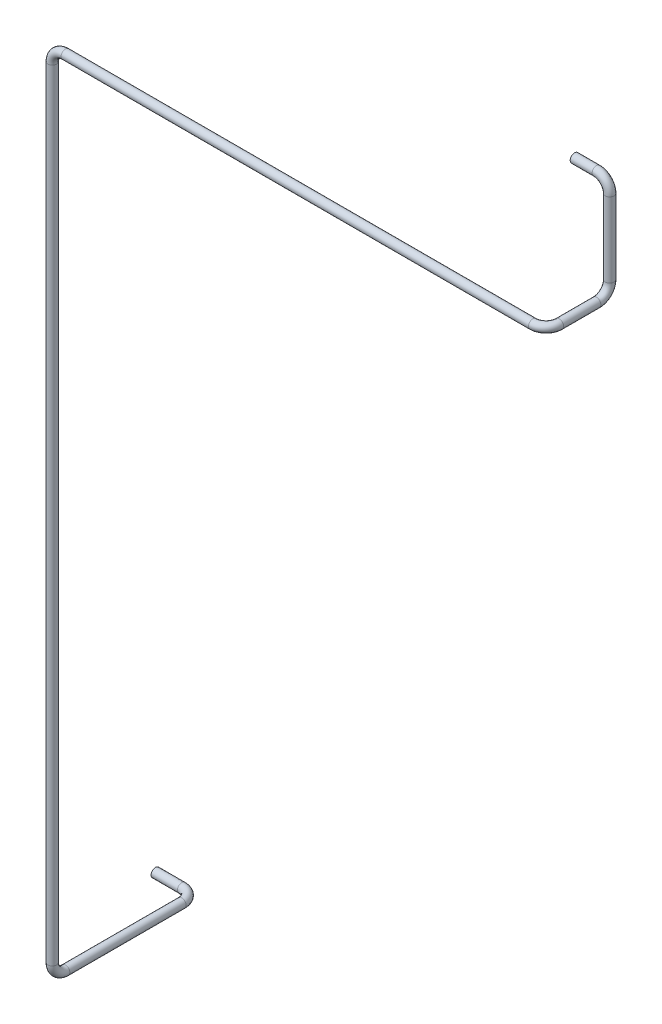
ISO-10303-21;
HEADER;
FILE_DESCRIPTION(('STEP AP214'),'2;1');
FILE_NAME('part.step','',(''),(''),'','','');
FILE_SCHEMA(('AUTOMOTIVE_DESIGN { 1 0 10303 214 1 1 1 1 }'));
ENDSEC;
DATA;
#1=APPLICATION_CONTEXT('core data for automotive mechanical design processes');
#2=APPLICATION_PROTOCOL_DEFINITION('international standard','automotive_design',2000,#1);
#3=PRODUCT_CONTEXT('',#1,'mechanical');
#4=PRODUCT('Part','Part','',(#3));
#5=PRODUCT_RELATED_PRODUCT_CATEGORY('part','',(#4));
#6=PRODUCT_DEFINITION_FORMATION('','',#4);
#7=PRODUCT_DEFINITION_CONTEXT('part definition',#1,'design');
#8=PRODUCT_DEFINITION('design','',#6,#7);
#9=PRODUCT_DEFINITION_SHAPE('','',#8);
#10=(LENGTH_UNIT() NAMED_UNIT(*) SI_UNIT(.MILLI.,.METRE.));
#11=(NAMED_UNIT(*) PLANE_ANGLE_UNIT() SI_UNIT($,.RADIAN.));
#12=(NAMED_UNIT(*) SI_UNIT($,.STERADIAN.) SOLID_ANGLE_UNIT());
#13=UNCERTAINTY_MEASURE_WITH_UNIT(LENGTH_MEASURE(1.E-05),#10,'distance_accuracy_value','');
#14=(GEOMETRIC_REPRESENTATION_CONTEXT(3) GLOBAL_UNCERTAINTY_ASSIGNED_CONTEXT((#13)) GLOBAL_UNIT_ASSIGNED_CONTEXT((#10,
#11,#12)) REPRESENTATION_CONTEXT('',''));
#15=CARTESIAN_POINT('',(0.,0.,0.));
#16=DIRECTION('',(0.,0.,1.));
#17=DIRECTION('',(1.,0.,0.));
#18=AXIS2_PLACEMENT_3D('',#15,#16,#17);
#19=CARTESIAN_POINT('',(109.,471.,236.));
#20=DIRECTION('',(-1.,0.,0.));
#21=DIRECTION('',(0.,0.,-1.));
#22=AXIS2_PLACEMENT_3D('',#19,#20,#21);
#23=PLANE('',#22);
#24=CARTESIAN_POINT('',(109.,471.,236.));
#25=DIRECTION('',(-1.,0.,0.));
#26=DIRECTION('',(0.,0.,-1.));
#27=AXIS2_PLACEMENT_3D('',#24,#25,#26);
#28=CIRCLE('',#27,0.5);
#29=CARTESIAN_POINT('',(109.,471.,235.5));
#30=VERTEX_POINT('',#29);
#31=EDGE_CURVE('E412',#30,#30,#28,.T.);
#32=ORIENTED_EDGE('',*,*,#31,.F.);
#33=EDGE_LOOP('',(#32));
#34=FACE_BOUND('',#33,.T.);
#35=CARTESIAN_POINT('',(109.,471.,236.));
#36=DIRECTION('',(-1.,0.,0.));
#37=DIRECTION('',(0.,0.,1.));
#38=AXIS2_PLACEMENT_3D('',#35,#36,#37);
#39=CIRCLE('',#38,2.);
#40=CARTESIAN_POINT('',(109.,471.,238.));
#41=VERTEX_POINT('',#40);
#42=EDGE_CURVE('E75',#41,#41,#39,.T.);
#43=ORIENTED_EDGE('',*,*,#42,.T.);
#44=EDGE_LOOP('',(#43));
#45=FACE_BOUND('',#44,.T.);
#46=ADVANCED_FACE('F52',(#34,#45),#23,.T.);
#47=CARTESIAN_POINT('',(-118.,57.5,200.));
#48=DIRECTION('',(1.,0.,0.));
#49=DIRECTION('',(0.,0.,-1.));
#50=AXIS2_PLACEMENT_3D('',#47,#48,#49);
#51=PLANE('',#50);
#52=CARTESIAN_POINT('',(-118.,57.5,200.));
#53=DIRECTION('',(1.,0.,0.));
#54=DIRECTION('',(0.,0.,-1.));
#55=AXIS2_PLACEMENT_3D('',#52,#53,#54);
#56=CIRCLE('',#55,0.5);
#57=CARTESIAN_POINT('',(-118.,57.5,199.5));
#58=VERTEX_POINT('',#57);
#59=EDGE_CURVE('E73',#58,#58,#56,.T.);
#60=ORIENTED_EDGE('',*,*,#59,.T.);
#61=EDGE_LOOP('',(#60));
#62=FACE_BOUND('',#61,.T.);
#63=CARTESIAN_POINT('',(-118.,57.5,200.));
#64=DIRECTION('',(1.,0.,0.));
#65=DIRECTION('',(0.,0.,-1.));
#66=AXIS2_PLACEMENT_3D('',#63,#64,#65);
#67=CIRCLE('',#66,2.);
#68=CARTESIAN_POINT('',(-118.,57.5,198.));
#69=VERTEX_POINT('',#68);
#70=EDGE_CURVE('E11',#69,#69,#67,.T.);
#71=ORIENTED_EDGE('',*,*,#70,.F.);
#72=EDGE_LOOP('',(#71));
#73=FACE_BOUND('',#72,.T.);
#74=ADVANCED_FACE('F191',(#62,#73),#51,.F.);
#75=CARTESIAN_POINT('',(109.,471.,236.));
#76=DIRECTION('',(1.,0.,0.));
#77=DIRECTION('',(0.,0.,-1.));
#78=AXIS2_PLACEMENT_3D('',#75,#76,#77);
#79=CYLINDRICAL_SURFACE('',#78,2.);
#80=CARTESIAN_POINT('',(119.,471.,236.));
#81=DIRECTION('',(1.,0.,0.));
#82=DIRECTION('',(0.,0.,-1.));
#83=AXIS2_PLACEMENT_3D('',#80,#81,#82);
#84=CIRCLE('',#83,2.);
#85=CARTESIAN_POINT('',(119.,473.,236.));
#86=VERTEX_POINT('',#85);
#87=EDGE_CURVE('E74',#86,#86,#84,.F.);
#88=ORIENTED_EDGE('',*,*,#87,.T.);
#89=EDGE_LOOP('',(#88));
#90=FACE_BOUND('',#89,.T.);
#91=ORIENTED_EDGE('',*,*,#42,.F.);
#92=EDGE_LOOP('',(#91));
#93=FACE_BOUND('',#92,.T.);
#94=ADVANCED_FACE('F193',(#90,#93),#79,.T.);
#95=CARTESIAN_POINT('',(119.,465.,236.));
#96=DIRECTION('',(0.,0.,-1.));
#97=DIRECTION('',(-1.,0.,0.));
#98=AXIS2_PLACEMENT_3D('',#95,#96,#97);
#99=TOROIDAL_SURFACE('',#98,6.00000000000006,2.);
#100=CARTESIAN_POINT('',(125.,465.,236.));
#101=DIRECTION('',(0.,1.,0.));
#102=DIRECTION('',(-1.,0.,0.));
#103=AXIS2_PLACEMENT_3D('',#100,#101,#102);
#104=CIRCLE('',#103,2.);
#105=CARTESIAN_POINT('',(127.,465.,236.));
#106=VERTEX_POINT('',#105);
#107=EDGE_CURVE('E78',#106,#106,#104,.T.);
#108=CARTESIAN_POINT('',(119.,465.,236.));
#109=DIRECTION('',(0.,0.,-1.));
#110=DIRECTION('',(-1.,0.,0.));
#111=AXIS2_PLACEMENT_3D('',#108,#109,#110);
#112=CIRCLE('',#111,8.00000000000006);
#113=EDGE_CURVE('',#86,#106,#112,.T.);
#114=ORIENTED_EDGE('',*,*,#87,.F.);
#115=ORIENTED_EDGE('',*,*,#107,.T.);
#116=ORIENTED_EDGE('',*,*,#113,.T.);
#117=ORIENTED_EDGE('',*,*,#113,.F.);
#118=EDGE_LOOP('',(#114,#116,#115,#117));
#119=FACE_BOUND('',#118,.T.);
#120=ADVANCED_FACE('F199',(#119),#99,.T.);
#121=CARTESIAN_POINT('',(125.,465.,236.));
#122=DIRECTION('',(0.,-1.,0.));
#123=DIRECTION('',(0.,0.,-1.));
#124=AXIS2_PLACEMENT_3D('',#121,#122,#123);
#125=CYLINDRICAL_SURFACE('',#124,2.);
#126=CARTESIAN_POINT('',(125.,431.,236.));
#127=DIRECTION('',(0.,-1.,0.));
#128=DIRECTION('',(0.,0.,-1.));
#129=AXIS2_PLACEMENT_3D('',#126,#127,#128);
#130=CIRCLE('',#129,2.);
#131=CARTESIAN_POINT('',(125.,431.,234.));
#132=VERTEX_POINT('',#131);
#133=EDGE_CURVE('E91',#132,#132,#130,.F.);
#134=ORIENTED_EDGE('',*,*,#133,.T.);
#135=EDGE_LOOP('',(#134));
#136=FACE_BOUND('',#135,.T.);
#137=ORIENTED_EDGE('',*,*,#107,.F.);
#138=EDGE_LOOP('',(#137));
#139=FACE_BOUND('',#138,.T.);
#140=ADVANCED_FACE('F204',(#136,#139),#125,.T.);
#141=CARTESIAN_POINT('',(125.,431.,242.));
#142=DIRECTION('',(-1.,0.,0.));
#143=DIRECTION('',(0.,0.,1.));
#144=AXIS2_PLACEMENT_3D('',#141,#142,#143);
#145=TOROIDAL_SURFACE('',#144,6.00000000000001,2.);
#146=CARTESIAN_POINT('',(125.,425.,242.));
#147=DIRECTION('',(0.,0.,-1.));
#148=DIRECTION('',(0.,1.,0.));
#149=AXIS2_PLACEMENT_3D('',#146,#147,#148);
#150=CIRCLE('',#149,2.);
#151=CARTESIAN_POINT('',(125.,423.,242.));
#152=VERTEX_POINT('',#151);
#153=EDGE_CURVE('E96',#152,#152,#150,.T.);
#154=CARTESIAN_POINT('',(125.,431.,242.));
#155=DIRECTION('',(-1.,0.,0.));
#156=DIRECTION('',(0.,0.,1.));
#157=AXIS2_PLACEMENT_3D('',#154,#155,#156);
#158=CIRCLE('',#157,8.00000000000001);
#159=EDGE_CURVE('',#132,#152,#158,.T.);
#160=ORIENTED_EDGE('',*,*,#133,.F.);
#161=ORIENTED_EDGE('',*,*,#153,.T.);
#162=ORIENTED_EDGE('',*,*,#159,.T.);
#163=ORIENTED_EDGE('',*,*,#159,.F.);
#164=EDGE_LOOP('',(#160,#162,#161,#163));
#165=FACE_BOUND('',#164,.T.);
#166=ADVANCED_FACE('F208',(#165),#145,.T.);
#167=CARTESIAN_POINT('',(125.,425.,242.));
#168=DIRECTION('',(0.,0.,1.));
#169=DIRECTION('',(1.,0.,0.));
#170=AXIS2_PLACEMENT_3D('',#167,#168,#169);
#171=CYLINDRICAL_SURFACE('',#170,2.);
#172=CARTESIAN_POINT('',(125.,425.,259.));
#173=DIRECTION('',(0.,0.,1.));
#174=DIRECTION('',(1.,0.,0.));
#175=AXIS2_PLACEMENT_3D('',#172,#173,#174);
#176=CIRCLE('',#175,2.);
#177=CARTESIAN_POINT('',(127.,425.,259.));
#178=VERTEX_POINT('',#177);
#179=EDGE_CURVE('E97',#178,#178,#176,.F.);
#180=ORIENTED_EDGE('',*,*,#179,.T.);
#181=EDGE_LOOP('',(#180));
#182=FACE_BOUND('',#181,.T.);
#183=ORIENTED_EDGE('',*,*,#153,.F.);
#184=EDGE_LOOP('',(#183));
#185=FACE_BOUND('',#184,.T.);
#186=ADVANCED_FACE('F215',(#182,#185),#171,.T.);
#187=CARTESIAN_POINT('',(119.,425.,259.));
#188=DIRECTION('',(0.,-1.,0.));
#189=DIRECTION('',(0.,0.,-1.));
#190=AXIS2_PLACEMENT_3D('',#187,#188,#189);
#191=TOROIDAL_SURFACE('',#190,6.00000000000001,2.);
#192=CARTESIAN_POINT('',(119.,425.,265.));
#193=DIRECTION('',(1.,0.,0.));
#194=DIRECTION('',(0.,0.,-1.));
#195=AXIS2_PLACEMENT_3D('',#192,#193,#194);
#196=CIRCLE('',#195,2.);
#197=CARTESIAN_POINT('',(119.,425.,267.));
#198=VERTEX_POINT('',#197);
#199=EDGE_CURVE('E105',#198,#198,#196,.T.);
#200=CARTESIAN_POINT('',(119.,425.,259.));
#201=DIRECTION('',(0.,-1.,0.));
#202=DIRECTION('',(0.,0.,-1.));
#203=AXIS2_PLACEMENT_3D('',#200,#201,#202);
#204=CIRCLE('',#203,8.00000000000001);
#205=EDGE_CURVE('',#178,#198,#204,.T.);
#206=ORIENTED_EDGE('',*,*,#179,.F.);
#207=ORIENTED_EDGE('',*,*,#199,.T.);
#208=ORIENTED_EDGE('',*,*,#205,.T.);
#209=ORIENTED_EDGE('',*,*,#205,.F.);
#210=EDGE_LOOP('',(#206,#208,#207,#209));
#211=FACE_BOUND('',#210,.T.);
#212=ADVANCED_FACE('F216',(#211),#191,.T.);
#213=CARTESIAN_POINT('',(119.,425.,265.));
#214=DIRECTION('',(-1.,0.,0.));
#215=DIRECTION('',(0.,0.,1.));
#216=AXIS2_PLACEMENT_3D('',#213,#214,#215);
#217=CYLINDRICAL_SURFACE('',#216,2.);
#218=CARTESIAN_POINT('',(-94.,425.,265.));
#219=DIRECTION('',(-1.,0.,0.));
#220=DIRECTION('',(0.,0.,1.));
#221=AXIS2_PLACEMENT_3D('',#218,#219,#220);
#222=CIRCLE('',#221,2.);
#223=CARTESIAN_POINT('',(-94.,427.,265.));
#224=VERTEX_POINT('',#223);
#225=EDGE_CURVE('E104',#224,#224,#222,.F.);
#226=ORIENTED_EDGE('',*,*,#225,.T.);
#227=EDGE_LOOP('',(#226));
#228=FACE_BOUND('',#227,.T.);
#229=ORIENTED_EDGE('',*,*,#199,.F.);
#230=EDGE_LOOP('',(#229));
#231=FACE_BOUND('',#230,.T.);
#232=ADVANCED_FACE('F219',(#228,#231),#217,.T.);
#233=CARTESIAN_POINT('',(-94.,419.,265.));
#234=DIRECTION('',(0.,0.,1.));
#235=DIRECTION('',(1.,0.,0.));
#236=AXIS2_PLACEMENT_3D('',#233,#234,#235);
#237=TOROIDAL_SURFACE('',#236,6.00000000000001,2.);
#238=CARTESIAN_POINT('',(-100.,419.,265.));
#239=DIRECTION('',(0.,1.,0.));
#240=DIRECTION('',(-1.,0.,0.));
#241=AXIS2_PLACEMENT_3D('',#238,#239,#240);
#242=CIRCLE('',#241,2.);
#243=CARTESIAN_POINT('',(-102.,419.,265.));
#244=VERTEX_POINT('',#243);
#245=EDGE_CURVE('E107',#244,#244,#242,.T.);
#246=CARTESIAN_POINT('',(-94.,419.,265.));
#247=DIRECTION('',(0.,0.,1.));
#248=DIRECTION('',(1.,0.,0.));
#249=AXIS2_PLACEMENT_3D('',#246,#247,#248);
#250=CIRCLE('',#249,8.00000000000001);
#251=EDGE_CURVE('',#224,#244,#250,.T.);
#252=ORIENTED_EDGE('',*,*,#225,.F.);
#253=ORIENTED_EDGE('',*,*,#245,.T.);
#254=ORIENTED_EDGE('',*,*,#251,.T.);
#255=ORIENTED_EDGE('',*,*,#251,.F.);
#256=EDGE_LOOP('',(#252,#254,#253,#255));
#257=FACE_BOUND('',#256,.T.);
#258=ADVANCED_FACE('F221',(#257),#237,.T.);
#259=CARTESIAN_POINT('',(-100.,419.,265.));
#260=DIRECTION('',(0.,-1.,0.));
#261=DIRECTION('',(0.,0.,-1.));
#262=AXIS2_PLACEMENT_3D('',#259,#260,#261);
#263=CYLINDRICAL_SURFACE('',#262,2.);
#264=CARTESIAN_POINT('',(-100.,63.5,265.));
#265=DIRECTION('',(0.,-1.,0.));
#266=DIRECTION('',(0.,0.,-1.));
#267=AXIS2_PLACEMENT_3D('',#264,#265,#266);
#268=CIRCLE('',#267,2.);
#269=CARTESIAN_POINT('',(-100.,63.5,267.));
#270=VERTEX_POINT('',#269);
#271=EDGE_CURVE('E112',#270,#270,#268,.F.);
#272=ORIENTED_EDGE('',*,*,#271,.T.);
#273=EDGE_LOOP('',(#272));
#274=FACE_BOUND('',#273,.T.);
#275=ORIENTED_EDGE('',*,*,#245,.F.);
#276=EDGE_LOOP('',(#275));
#277=FACE_BOUND('',#276,.T.);
#278=ADVANCED_FACE('F126',(#274,#277),#263,.T.);
#279=CARTESIAN_POINT('',(-100.,63.5,259.));
#280=DIRECTION('',(1.,0.,0.));
#281=DIRECTION('',(0.,0.,-1.));
#282=AXIS2_PLACEMENT_3D('',#279,#280,#281);
#283=TOROIDAL_SURFACE('',#282,6.00000000000001,2.);
#284=CARTESIAN_POINT('',(-100.,57.5,259.));
#285=DIRECTION('',(0.,0.,1.));
#286=DIRECTION('',(0.,-1.,0.));
#287=AXIS2_PLACEMENT_3D('',#284,#285,#286);
#288=CIRCLE('',#287,2.);
#289=CARTESIAN_POINT('',(-100.,55.5,259.));
#290=VERTEX_POINT('',#289);
#291=EDGE_CURVE('E68',#290,#290,#288,.T.);
#292=CARTESIAN_POINT('',(-100.,63.5,259.));
#293=DIRECTION('',(1.,0.,0.));
#294=DIRECTION('',(0.,0.,-1.));
#295=AXIS2_PLACEMENT_3D('',#292,#293,#294);
#296=CIRCLE('',#295,8.00000000000001);
#297=EDGE_CURVE('',#270,#290,#296,.T.);
#298=ORIENTED_EDGE('',*,*,#271,.F.);
#299=ORIENTED_EDGE('',*,*,#291,.T.);
#300=ORIENTED_EDGE('',*,*,#297,.T.);
#301=ORIENTED_EDGE('',*,*,#297,.F.);
#302=EDGE_LOOP('',(#298,#300,#299,#301));
#303=FACE_BOUND('',#302,.T.);
#304=ADVANCED_FACE('F119',(#303),#283,.T.);
#305=CARTESIAN_POINT('',(-100.,57.5,259.));
#306=DIRECTION('',(0.,0.,-1.));
#307=DIRECTION('',(-1.,0.,0.));
#308=AXIS2_PLACEMENT_3D('',#305,#306,#307);
#309=CYLINDRICAL_SURFACE('',#308,2.);
#310=CARTESIAN_POINT('',(-100.,57.5,206.));
#311=DIRECTION('',(0.,0.,-1.));
#312=DIRECTION('',(-1.,0.,0.));
#313=AXIS2_PLACEMENT_3D('',#310,#311,#312);
#314=CIRCLE('',#313,2.);
#315=CARTESIAN_POINT('',(-98.,57.5,206.));
#316=VERTEX_POINT('',#315);
#317=EDGE_CURVE('E63',#316,#316,#314,.F.);
#318=ORIENTED_EDGE('',*,*,#317,.T.);
#319=EDGE_LOOP('',(#318));
#320=FACE_BOUND('',#319,.T.);
#321=ORIENTED_EDGE('',*,*,#291,.F.);
#322=EDGE_LOOP('',(#321));
#323=FACE_BOUND('',#322,.T.);
#324=ADVANCED_FACE('F118',(#320,#323),#309,.T.);
#325=CARTESIAN_POINT('',(-106.,57.5,206.));
#326=DIRECTION('',(0.,1.,0.));
#327=DIRECTION('',(0.,0.,1.));
#328=AXIS2_PLACEMENT_3D('',#325,#326,#327);
#329=TOROIDAL_SURFACE('',#328,6.00000000000001,2.);
#330=CARTESIAN_POINT('',(-106.,57.5,200.));
#331=DIRECTION('',(1.,0.,0.));
#332=DIRECTION('',(0.,0.,-1.));
#333=AXIS2_PLACEMENT_3D('',#330,#331,#332);
#334=CIRCLE('',#333,2.);
#335=CARTESIAN_POINT('',(-105.999999999999,57.5,198.));
#336=VERTEX_POINT('',#335);
#337=EDGE_CURVE('E58',#336,#336,#334,.T.);
#338=CARTESIAN_POINT('',(-106.,57.5,206.));
#339=DIRECTION('',(0.,1.,0.));
#340=DIRECTION('',(0.,0.,1.));
#341=AXIS2_PLACEMENT_3D('',#338,#339,#340);
#342=CIRCLE('',#341,8.00000000000001);
#343=EDGE_CURVE('',#316,#336,#342,.T.);
#344=ORIENTED_EDGE('',*,*,#317,.F.);
#345=ORIENTED_EDGE('',*,*,#337,.T.);
#346=ORIENTED_EDGE('',*,*,#343,.T.);
#347=ORIENTED_EDGE('',*,*,#343,.F.);
#348=EDGE_LOOP('',(#344,#346,#345,#347));
#349=FACE_BOUND('',#348,.T.);
#350=ADVANCED_FACE('F121',(#349),#329,.T.);
#351=CARTESIAN_POINT('',(-106.,57.5,200.));
#352=DIRECTION('',(-1.,0.,0.));
#353=DIRECTION('',(0.,0.,1.));
#354=AXIS2_PLACEMENT_3D('',#351,#352,#353);
#355=CYLINDRICAL_SURFACE('',#354,2.);
#356=ORIENTED_EDGE('',*,*,#70,.T.);
#357=EDGE_LOOP('',(#356));
#358=FACE_BOUND('',#357,.T.);
#359=ORIENTED_EDGE('',*,*,#337,.F.);
#360=EDGE_LOOP('',(#359));
#361=FACE_BOUND('',#360,.T.);
#362=ADVANCED_FACE('F54',(#358,#361),#355,.T.);
#363=CARTESIAN_POINT('',(109.,471.,236.));
#364=DIRECTION('',(1.,0.,0.));
#365=DIRECTION('',(0.,0.,-1.));
#366=AXIS2_PLACEMENT_3D('',#363,#364,#365);
#367=CYLINDRICAL_SURFACE('',#366,0.5);
#368=CARTESIAN_POINT('',(119.,471.,236.));
#369=DIRECTION('',(-1.,0.,0.));
#370=DIRECTION('',(0.,0.,-1.));
#371=AXIS2_PLACEMENT_3D('',#368,#369,#370);
#372=CIRCLE('',#371,0.5);
#373=CARTESIAN_POINT('',(119.,471.5,236.));
#374=VERTEX_POINT('',#373);
#375=EDGE_CURVE('E413',#374,#374,#372,.T.);
#376=ORIENTED_EDGE('',*,*,#375,.F.);
#377=EDGE_LOOP('',(#376));
#378=FACE_BOUND('',#377,.T.);
#379=ORIENTED_EDGE('',*,*,#31,.T.);
#380=EDGE_LOOP('',(#379));
#381=FACE_BOUND('',#380,.T.);
#382=ADVANCED_FACE('F134',(#378,#381),#367,.F.);
#383=CARTESIAN_POINT('',(119.,465.,236.));
#384=DIRECTION('',(0.,0.,-1.));
#385=DIRECTION('',(-1.,0.,0.));
#386=AXIS2_PLACEMENT_3D('',#383,#384,#385);
#387=TOROIDAL_SURFACE('',#386,6.00000000000006,0.5);
#388=CARTESIAN_POINT('',(125.,465.,236.));
#389=DIRECTION('',(0.,1.,0.));
#390=DIRECTION('',(0.,0.,-1.));
#391=AXIS2_PLACEMENT_3D('',#388,#389,#390);
#392=CIRCLE('',#391,0.5);
#393=CARTESIAN_POINT('',(125.5,465.,236.));
#394=VERTEX_POINT('',#393);
#395=EDGE_CURVE('E417',#394,#394,#392,.T.);
#396=CARTESIAN_POINT('',(119.,465.,236.));
#397=DIRECTION('',(0.,0.,-1.));
#398=DIRECTION('',(-1.,0.,0.));
#399=AXIS2_PLACEMENT_3D('',#396,#397,#398);
#400=CIRCLE('',#399,6.50000000000006);
#401=EDGE_CURVE('',#374,#394,#400,.T.);
#402=ORIENTED_EDGE('',*,*,#375,.T.);
#403=ORIENTED_EDGE('',*,*,#395,.F.);
#404=ORIENTED_EDGE('',*,*,#401,.T.);
#405=ORIENTED_EDGE('',*,*,#401,.F.);
#406=EDGE_LOOP('',(#402,#404,#403,#405));
#407=FACE_BOUND('',#406,.T.);
#408=ADVANCED_FACE('F132',(#407),#387,.F.);
#409=CARTESIAN_POINT('',(125.,465.,236.));
#410=DIRECTION('',(0.,-1.,0.));
#411=DIRECTION('',(0.,0.,-1.));
#412=AXIS2_PLACEMENT_3D('',#409,#410,#411);
#413=CYLINDRICAL_SURFACE('',#412,0.5);
#414=CARTESIAN_POINT('',(125.,431.,236.));
#415=DIRECTION('',(0.,1.,0.));
#416=DIRECTION('',(0.,0.,-1.));
#417=AXIS2_PLACEMENT_3D('',#414,#415,#416);
#418=CIRCLE('',#417,0.5);
#419=CARTESIAN_POINT('',(125.,431.,235.5));
#420=VERTEX_POINT('',#419);
#421=EDGE_CURVE('E425',#420,#420,#418,.T.);
#422=ORIENTED_EDGE('',*,*,#421,.F.);
#423=EDGE_LOOP('',(#422));
#424=FACE_BOUND('',#423,.T.);
#425=ORIENTED_EDGE('',*,*,#395,.T.);
#426=EDGE_LOOP('',(#425));
#427=FACE_BOUND('',#426,.T.);
#428=ADVANCED_FACE('F142',(#424,#427),#413,.F.);
#429=CARTESIAN_POINT('',(125.,431.,242.));
#430=DIRECTION('',(-1.,0.,0.));
#431=DIRECTION('',(0.,0.,1.));
#432=AXIS2_PLACEMENT_3D('',#429,#430,#431);
#433=TOROIDAL_SURFACE('',#432,6.00000000000001,0.5);
#434=CARTESIAN_POINT('',(125.,425.,242.));
#435=DIRECTION('',(0.,0.,-1.));
#436=DIRECTION('',(0.,-1.,0.));
#437=AXIS2_PLACEMENT_3D('',#434,#435,#436);
#438=CIRCLE('',#437,0.5);
#439=CARTESIAN_POINT('',(125.,424.5,242.));
#440=VERTEX_POINT('',#439);
#441=EDGE_CURVE('E422',#440,#440,#438,.T.);
#442=CARTESIAN_POINT('',(125.,431.,242.));
#443=DIRECTION('',(-1.,0.,0.));
#444=DIRECTION('',(0.,0.,1.));
#445=AXIS2_PLACEMENT_3D('',#442,#443,#444);
#446=CIRCLE('',#445,6.50000000000001);
#447=EDGE_CURVE('',#420,#440,#446,.T.);
#448=ORIENTED_EDGE('',*,*,#421,.T.);
#449=ORIENTED_EDGE('',*,*,#441,.F.);
#450=ORIENTED_EDGE('',*,*,#447,.T.);
#451=ORIENTED_EDGE('',*,*,#447,.F.);
#452=EDGE_LOOP('',(#448,#450,#449,#451));
#453=FACE_BOUND('',#452,.T.);
#454=ADVANCED_FACE('F147',(#453),#433,.F.);
#455=CARTESIAN_POINT('',(125.,425.,242.));
#456=DIRECTION('',(0.,0.,1.));
#457=DIRECTION('',(1.,0.,0.));
#458=AXIS2_PLACEMENT_3D('',#455,#456,#457);
#459=CYLINDRICAL_SURFACE('',#458,0.5);
#460=CARTESIAN_POINT('',(125.,425.,259.));
#461=DIRECTION('',(0.,0.,-1.));
#462=DIRECTION('',(0.,-1.,0.));
#463=AXIS2_PLACEMENT_3D('',#460,#461,#462);
#464=CIRCLE('',#463,0.5);
#465=CARTESIAN_POINT('',(125.5,425.,259.));
#466=VERTEX_POINT('',#465);
#467=EDGE_CURVE('E428',#466,#466,#464,.T.);
#468=ORIENTED_EDGE('',*,*,#467,.F.);
#469=EDGE_LOOP('',(#468));
#470=FACE_BOUND('',#469,.T.);
#471=ORIENTED_EDGE('',*,*,#441,.T.);
#472=EDGE_LOOP('',(#471));
#473=FACE_BOUND('',#472,.T.);
#474=ADVANCED_FACE('F152',(#470,#473),#459,.F.);
#475=CARTESIAN_POINT('',(119.,425.,259.));
#476=DIRECTION('',(0.,-1.,0.));
#477=DIRECTION('',(0.,0.,-1.));
#478=AXIS2_PLACEMENT_3D('',#475,#476,#477);
#479=TOROIDAL_SURFACE('',#478,6.00000000000001,0.5);
#480=CARTESIAN_POINT('',(119.,425.,265.));
#481=DIRECTION('',(1.,0.,0.));
#482=DIRECTION('',(0.,-1.,0.));
#483=AXIS2_PLACEMENT_3D('',#480,#481,#482);
#484=CIRCLE('',#483,0.5);
#485=CARTESIAN_POINT('',(119.,425.,265.5));
#486=VERTEX_POINT('',#485);
#487=EDGE_CURVE('E431',#486,#486,#484,.T.);
#488=CARTESIAN_POINT('',(119.,425.,259.));
#489=DIRECTION('',(0.,-1.,0.));
#490=DIRECTION('',(0.,0.,-1.));
#491=AXIS2_PLACEMENT_3D('',#488,#489,#490);
#492=CIRCLE('',#491,6.50000000000001);
#493=EDGE_CURVE('',#466,#486,#492,.T.);
#494=ORIENTED_EDGE('',*,*,#467,.T.);
#495=ORIENTED_EDGE('',*,*,#487,.F.);
#496=ORIENTED_EDGE('',*,*,#493,.T.);
#497=ORIENTED_EDGE('',*,*,#493,.F.);
#498=EDGE_LOOP('',(#494,#496,#495,#497));
#499=FACE_BOUND('',#498,.T.);
#500=ADVANCED_FACE('F158',(#499),#479,.F.);
#501=CARTESIAN_POINT('',(119.,425.,265.));
#502=DIRECTION('',(-1.,0.,0.));
#503=DIRECTION('',(0.,0.,1.));
#504=AXIS2_PLACEMENT_3D('',#501,#502,#503);
#505=CYLINDRICAL_SURFACE('',#504,0.5);
#506=CARTESIAN_POINT('',(-94.,425.,265.));
#507=DIRECTION('',(1.,0.,0.));
#508=DIRECTION('',(0.,-1.,0.));
#509=AXIS2_PLACEMENT_3D('',#506,#507,#508);
#510=CIRCLE('',#509,0.5);
#511=CARTESIAN_POINT('',(-94.,425.5,265.));
#512=VERTEX_POINT('',#511);
#513=EDGE_CURVE('E432',#512,#512,#510,.T.);
#514=ORIENTED_EDGE('',*,*,#513,.F.);
#515=EDGE_LOOP('',(#514));
#516=FACE_BOUND('',#515,.T.);
#517=ORIENTED_EDGE('',*,*,#487,.T.);
#518=EDGE_LOOP('',(#517));
#519=FACE_BOUND('',#518,.T.);
#520=ADVANCED_FACE('F165',(#516,#519),#505,.F.);
#521=CARTESIAN_POINT('',(-94.,419.,265.));
#522=DIRECTION('',(0.,0.,1.));
#523=DIRECTION('',(1.,0.,0.));
#524=AXIS2_PLACEMENT_3D('',#521,#522,#523);
#525=TOROIDAL_SURFACE('',#524,6.00000000000001,0.5);
#526=CARTESIAN_POINT('',(-100.,419.,265.));
#527=DIRECTION('',(0.,1.,0.));
#528=DIRECTION('',(1.,0.,0.));
#529=AXIS2_PLACEMENT_3D('',#526,#527,#528);
#530=CIRCLE('',#529,0.5);
#531=CARTESIAN_POINT('',(-100.5,419.,265.));
#532=VERTEX_POINT('',#531);
#533=EDGE_CURVE('E440',#532,#532,#530,.T.);
#534=CARTESIAN_POINT('',(-94.,419.,265.));
#535=DIRECTION('',(0.,0.,1.));
#536=DIRECTION('',(1.,0.,0.));
#537=AXIS2_PLACEMENT_3D('',#534,#535,#536);
#538=CIRCLE('',#537,6.50000000000001);
#539=EDGE_CURVE('',#512,#532,#538,.T.);
#540=ORIENTED_EDGE('',*,*,#513,.T.);
#541=ORIENTED_EDGE('',*,*,#533,.F.);
#542=ORIENTED_EDGE('',*,*,#539,.T.);
#543=ORIENTED_EDGE('',*,*,#539,.F.);
#544=EDGE_LOOP('',(#540,#542,#541,#543));
#545=FACE_BOUND('',#544,.T.);
#546=ADVANCED_FACE('F167',(#545),#525,.F.);
#547=CARTESIAN_POINT('',(-100.,419.,265.));
#548=DIRECTION('',(0.,-1.,0.));
#549=DIRECTION('',(0.,0.,-1.));
#550=AXIS2_PLACEMENT_3D('',#547,#548,#549);
#551=CYLINDRICAL_SURFACE('',#550,0.5);
#552=CARTESIAN_POINT('',(-100.,63.5,265.));
#553=DIRECTION('',(0.,1.,0.));
#554=DIRECTION('',(1.,0.,0.));
#555=AXIS2_PLACEMENT_3D('',#552,#553,#554);
#556=CIRCLE('',#555,0.5);
#557=CARTESIAN_POINT('',(-100.,63.5,265.5));
#558=VERTEX_POINT('',#557);
#559=EDGE_CURVE('E439',#558,#558,#556,.T.);
#560=ORIENTED_EDGE('',*,*,#559,.F.);
#561=EDGE_LOOP('',(#560));
#562=FACE_BOUND('',#561,.T.);
#563=ORIENTED_EDGE('',*,*,#533,.T.);
#564=EDGE_LOOP('',(#563));
#565=FACE_BOUND('',#564,.T.);
#566=ADVANCED_FACE('F168',(#562,#565),#551,.F.);
#567=CARTESIAN_POINT('',(-100.,63.5,259.));
#568=DIRECTION('',(1.,0.,0.));
#569=DIRECTION('',(0.,0.,-1.));
#570=AXIS2_PLACEMENT_3D('',#567,#568,#569);
#571=TOROIDAL_SURFACE('',#570,6.00000000000001,0.5);
#572=CARTESIAN_POINT('',(-100.,57.5,259.));
#573=DIRECTION('',(0.,0.,1.));
#574=DIRECTION('',(1.,0.,0.));
#575=AXIS2_PLACEMENT_3D('',#572,#573,#574);
#576=CIRCLE('',#575,0.5);
#577=CARTESIAN_POINT('',(-100.,57.,259.));
#578=VERTEX_POINT('',#577);
#579=EDGE_CURVE('E444',#578,#578,#576,.T.);
#580=CARTESIAN_POINT('',(-100.,63.5,259.));
#581=DIRECTION('',(1.,0.,0.));
#582=DIRECTION('',(0.,0.,-1.));
#583=AXIS2_PLACEMENT_3D('',#580,#581,#582);
#584=CIRCLE('',#583,6.50000000000001);
#585=EDGE_CURVE('',#558,#578,#584,.T.);
#586=ORIENTED_EDGE('',*,*,#559,.T.);
#587=ORIENTED_EDGE('',*,*,#579,.F.);
#588=ORIENTED_EDGE('',*,*,#585,.T.);
#589=ORIENTED_EDGE('',*,*,#585,.F.);
#590=EDGE_LOOP('',(#586,#588,#587,#589));
#591=FACE_BOUND('',#590,.T.);
#592=ADVANCED_FACE('F173',(#591),#571,.F.);
#593=CARTESIAN_POINT('',(-100.,57.5,259.));
#594=DIRECTION('',(0.,0.,-1.));
#595=DIRECTION('',(-1.,0.,0.));
#596=AXIS2_PLACEMENT_3D('',#593,#594,#595);
#597=CYLINDRICAL_SURFACE('',#596,0.5);
#598=CARTESIAN_POINT('',(-100.,57.5,206.));
#599=DIRECTION('',(0.,0.,1.));
#600=DIRECTION('',(1.,0.,0.));
#601=AXIS2_PLACEMENT_3D('',#598,#599,#600);
#602=CIRCLE('',#601,0.5);
#603=CARTESIAN_POINT('',(-99.5,57.5,206.));
#604=VERTEX_POINT('',#603);
#605=EDGE_CURVE('E87',#604,#604,#602,.T.);
#606=ORIENTED_EDGE('',*,*,#605,.F.);
#607=EDGE_LOOP('',(#606));
#608=FACE_BOUND('',#607,.T.);
#609=ORIENTED_EDGE('',*,*,#579,.T.);
#610=EDGE_LOOP('',(#609));
#611=FACE_BOUND('',#610,.T.);
#612=ADVANCED_FACE('F177',(#608,#611),#597,.F.);
#613=CARTESIAN_POINT('',(-106.,57.5,206.));
#614=DIRECTION('',(0.,1.,0.));
#615=DIRECTION('',(0.,0.,1.));
#616=AXIS2_PLACEMENT_3D('',#613,#614,#615);
#617=TOROIDAL_SURFACE('',#616,6.00000000000001,0.5);
#618=CARTESIAN_POINT('',(-106.,57.5,200.));
#619=DIRECTION('',(1.,0.,0.));
#620=DIRECTION('',(0.,0.,-1.));
#621=AXIS2_PLACEMENT_3D('',#618,#619,#620);
#622=CIRCLE('',#621,0.5);
#623=CARTESIAN_POINT('',(-106.,57.5,199.5));
#624=VERTEX_POINT('',#623);
#625=EDGE_CURVE('E85',#624,#624,#622,.T.);
#626=CARTESIAN_POINT('',(-106.,57.5,206.));
#627=DIRECTION('',(0.,1.,0.));
#628=DIRECTION('',(0.,0.,1.));
#629=AXIS2_PLACEMENT_3D('',#626,#627,#628);
#630=CIRCLE('',#629,6.50000000000001);
#631=EDGE_CURVE('',#604,#624,#630,.T.);
#632=ORIENTED_EDGE('',*,*,#605,.T.);
#633=ORIENTED_EDGE('',*,*,#625,.F.);
#634=ORIENTED_EDGE('',*,*,#631,.T.);
#635=ORIENTED_EDGE('',*,*,#631,.F.);
#636=EDGE_LOOP('',(#632,#634,#633,#635));
#637=FACE_BOUND('',#636,.T.);
#638=ADVANCED_FACE('F185',(#637),#617,.F.);
#639=CARTESIAN_POINT('',(-106.,57.5,200.));
#640=DIRECTION('',(-1.,0.,0.));
#641=DIRECTION('',(0.,0.,1.));
#642=AXIS2_PLACEMENT_3D('',#639,#640,#641);
#643=CYLINDRICAL_SURFACE('',#642,0.5);
#644=ORIENTED_EDGE('',*,*,#59,.F.);
#645=EDGE_LOOP('',(#644));
#646=FACE_BOUND('',#645,.T.);
#647=ORIENTED_EDGE('',*,*,#625,.T.);
#648=EDGE_LOOP('',(#647));
#649=FACE_BOUND('',#648,.T.);
#650=ADVANCED_FACE('F189',(#646,#649),#643,.F.);
#651=CLOSED_SHELL('',(#46,#74,#94,#120,#140,#166,#186,#212,#232,#258,#278,#304,#324,#350,#362,
#382,#408,#428,#454,#474,#500,#520,#546,#566,#592,#612,#638,#650));
#652=MANIFOLD_SOLID_BREP('B2',#651);
#653=ADVANCED_BREP_SHAPE_REPRESENTATION('',(#18,#652),#14);
#654=SHAPE_DEFINITION_REPRESENTATION(#9,#653);
ENDSEC;
END-ISO-10303-21;
